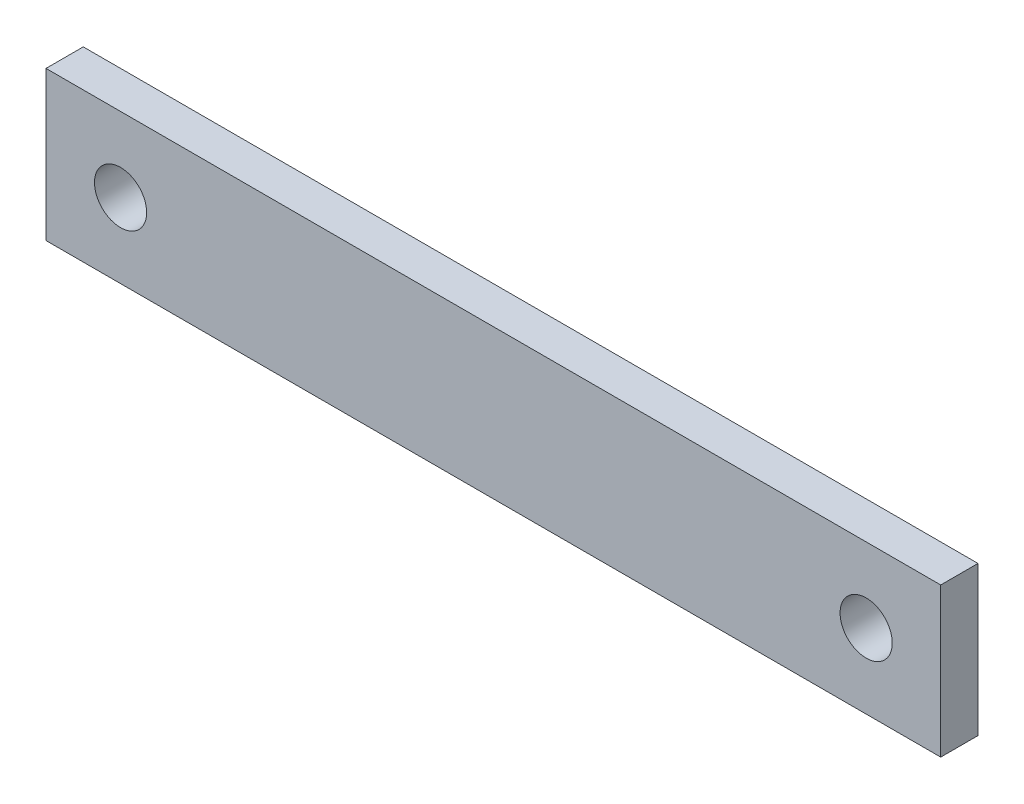
ISO-10303-21;
HEADER;
FILE_DESCRIPTION(('STEP AP214'),'2;1');
FILE_NAME('part.step','',(''),(''),'','','');
FILE_SCHEMA(('AUTOMOTIVE_DESIGN { 1 0 10303 214 1 1 1 1 }'));
ENDSEC;
DATA;
#1=APPLICATION_CONTEXT('core data for automotive mechanical design processes');
#2=APPLICATION_PROTOCOL_DEFINITION('international standard','automotive_design',2000,#1);
#3=PRODUCT_CONTEXT('',#1,'mechanical');
#4=PRODUCT('Part','Part','',(#3));
#5=PRODUCT_RELATED_PRODUCT_CATEGORY('part','',(#4));
#6=PRODUCT_DEFINITION_FORMATION('','',#4);
#7=PRODUCT_DEFINITION_CONTEXT('part definition',#1,'design');
#8=PRODUCT_DEFINITION('design','',#6,#7);
#9=PRODUCT_DEFINITION_SHAPE('','',#8);
#10=(LENGTH_UNIT() NAMED_UNIT(*) SI_UNIT(.MILLI.,.METRE.));
#11=(NAMED_UNIT(*) PLANE_ANGLE_UNIT() SI_UNIT($,.RADIAN.));
#12=(NAMED_UNIT(*) SI_UNIT($,.STERADIAN.) SOLID_ANGLE_UNIT());
#13=UNCERTAINTY_MEASURE_WITH_UNIT(LENGTH_MEASURE(1.E-05),#10,'distance_accuracy_value','');
#14=(GEOMETRIC_REPRESENTATION_CONTEXT(3) GLOBAL_UNCERTAINTY_ASSIGNED_CONTEXT((#13)) GLOBAL_UNIT_ASSIGNED_CONTEXT((#10,
#11,#12)) REPRESENTATION_CONTEXT('',''));
#15=CARTESIAN_POINT('',(0.,0.,0.));
#16=DIRECTION('',(0.,0.,1.));
#17=DIRECTION('',(1.,0.,0.));
#18=AXIS2_PLACEMENT_3D('',#15,#16,#17);
#19=CARTESIAN_POINT('',(0.,0.,10.));
#20=DIRECTION('',(0.,0.,-1.));
#21=DIRECTION('',(-1.,0.,0.));
#22=AXIS2_PLACEMENT_3D('',#19,#20,#21);
#23=PLANE('',#22);
#24=DIRECTION('',(0.,1.,0.));
#25=VECTOR('',#24,1.);
#26=CARTESIAN_POINT('',(120.,-20.,10.));
#27=LINE('',#26,#25);
#28=CARTESIAN_POINT('',(120.,-20.,10.));
#29=VERTEX_POINT('',#28);
#30=CARTESIAN_POINT('',(120.,20.,10.));
#31=VERTEX_POINT('',#30);
#32=EDGE_CURVE('E85',#29,#31,#27,.T.);
#33=ORIENTED_EDGE('',*,*,#32,.T.);
#34=DIRECTION('',(-1.,0.,0.));
#35=VECTOR('',#34,1.);
#36=CARTESIAN_POINT('',(-120.,20.,10.));
#37=LINE('',#36,#35);
#38=CARTESIAN_POINT('',(-120.,20.,10.));
#39=VERTEX_POINT('',#38);
#40=EDGE_CURVE('E80',#31,#39,#37,.T.);
#41=ORIENTED_EDGE('',*,*,#40,.T.);
#42=DIRECTION('',(0.,-1.,0.));
#43=VECTOR('',#42,1.);
#44=CARTESIAN_POINT('',(-120.,-20.,10.));
#45=LINE('',#44,#43);
#46=CARTESIAN_POINT('',(-120.,-20.,10.));
#47=VERTEX_POINT('',#46);
#48=EDGE_CURVE('E83',#39,#47,#45,.T.);
#49=ORIENTED_EDGE('',*,*,#48,.T.);
#50=DIRECTION('',(1.,0.,0.));
#51=VECTOR('',#50,1.);
#52=CARTESIAN_POINT('',(-120.,-20.,10.));
#53=LINE('',#52,#51);
#54=EDGE_CURVE('E50',#47,#29,#53,.T.);
#55=ORIENTED_EDGE('',*,*,#54,.T.);
#56=EDGE_LOOP('',(#33,#41,#49,#55));
#57=FACE_BOUND('',#56,.T.);
#58=CARTESIAN_POINT('',(-100.,0.,10.));
#59=DIRECTION('',(0.,0.,1.));
#60=DIRECTION('',(1.,0.,0.));
#61=AXIS2_PLACEMENT_3D('',#58,#59,#60);
#62=CIRCLE('',#61,7.);
#63=CARTESIAN_POINT('',(-93.,0.,10.));
#64=VERTEX_POINT('',#63);
#65=EDGE_CURVE('E100',#64,#64,#62,.T.);
#66=ORIENTED_EDGE('',*,*,#65,.F.);
#67=EDGE_LOOP('',(#66));
#68=FACE_BOUND('',#67,.T.);
#69=CARTESIAN_POINT('',(100.,0.,10.));
#70=DIRECTION('',(0.,0.,1.));
#71=DIRECTION('',(1.,0.,0.));
#72=AXIS2_PLACEMENT_3D('',#69,#70,#71);
#73=CIRCLE('',#72,7.);
#74=CARTESIAN_POINT('',(107.,0.,10.));
#75=VERTEX_POINT('',#74);
#76=EDGE_CURVE('E115',#75,#75,#73,.T.);
#77=ORIENTED_EDGE('',*,*,#76,.F.);
#78=EDGE_LOOP('',(#77));
#79=FACE_BOUND('',#78,.T.);
#80=ADVANCED_FACE('F33',(#57,#68,#79),#23,.F.);
#81=CARTESIAN_POINT('',(0.,0.,0.));
#82=DIRECTION('',(0.,0.,-1.));
#83=DIRECTION('',(-1.,0.,0.));
#84=AXIS2_PLACEMENT_3D('',#81,#82,#83);
#85=PLANE('',#84);
#86=CARTESIAN_POINT('',(-100.,0.,0.));
#87=DIRECTION('',(0.,0.,1.));
#88=DIRECTION('',(1.,0.,0.));
#89=AXIS2_PLACEMENT_3D('',#86,#87,#88);
#90=CIRCLE('',#89,7.);
#91=CARTESIAN_POINT('',(-93.,0.,0.));
#92=VERTEX_POINT('',#91);
#93=EDGE_CURVE('E112',#92,#92,#90,.T.);
#94=ORIENTED_EDGE('',*,*,#93,.T.);
#95=EDGE_LOOP('',(#94));
#96=FACE_BOUND('',#95,.T.);
#97=DIRECTION('',(0.,1.,0.));
#98=VECTOR('',#97,1.);
#99=CARTESIAN_POINT('',(120.,-20.,0.));
#100=LINE('',#99,#98);
#101=CARTESIAN_POINT('',(120.,-20.,0.));
#102=VERTEX_POINT('',#101);
#103=CARTESIAN_POINT('',(120.,20.,0.));
#104=VERTEX_POINT('',#103);
#105=EDGE_CURVE('E97',#102,#104,#100,.T.);
#106=ORIENTED_EDGE('',*,*,#105,.F.);
#107=DIRECTION('',(1.,0.,0.));
#108=VECTOR('',#107,1.);
#109=CARTESIAN_POINT('',(-120.,-20.,0.));
#110=LINE('',#109,#108);
#111=CARTESIAN_POINT('',(-120.,-20.,0.));
#112=VERTEX_POINT('',#111);
#113=EDGE_CURVE('E73',#112,#102,#110,.T.);
#114=ORIENTED_EDGE('',*,*,#113,.F.);
#115=DIRECTION('',(0.,-1.,0.));
#116=VECTOR('',#115,1.);
#117=CARTESIAN_POINT('',(-120.,-20.,0.));
#118=LINE('',#117,#116);
#119=CARTESIAN_POINT('',(-120.,20.,0.));
#120=VERTEX_POINT('',#119);
#121=EDGE_CURVE('E67',#120,#112,#118,.T.);
#122=ORIENTED_EDGE('',*,*,#121,.F.);
#123=DIRECTION('',(-1.,0.,0.));
#124=VECTOR('',#123,1.);
#125=CARTESIAN_POINT('',(-120.,20.,0.));
#126=LINE('',#125,#124);
#127=EDGE_CURVE('E89',#104,#120,#126,.T.);
#128=ORIENTED_EDGE('',*,*,#127,.F.);
#129=EDGE_LOOP('',(#106,#114,#122,#128));
#130=FACE_BOUND('',#129,.T.);
#131=CARTESIAN_POINT('',(100.,0.,0.));
#132=DIRECTION('',(0.,0.,1.));
#133=DIRECTION('',(1.,0.,0.));
#134=AXIS2_PLACEMENT_3D('',#131,#132,#133);
#135=CIRCLE('',#134,7.);
#136=CARTESIAN_POINT('',(107.,0.,0.));
#137=VERTEX_POINT('',#136);
#138=EDGE_CURVE('E118',#137,#137,#135,.T.);
#139=ORIENTED_EDGE('',*,*,#138,.T.);
#140=EDGE_LOOP('',(#139));
#141=FACE_BOUND('',#140,.T.);
#142=ADVANCED_FACE('F108',(#96,#130,#141),#85,.T.);
#143=CARTESIAN_POINT('',(120.,-20.,10.));
#144=DIRECTION('',(-1.,0.,0.));
#145=DIRECTION('',(0.,0.,1.));
#146=AXIS2_PLACEMENT_3D('',#143,#144,#145);
#147=PLANE('',#146);
#148=ORIENTED_EDGE('',*,*,#105,.T.);
#149=DIRECTION('',(0.,0.,-1.));
#150=VECTOR('',#149,1.);
#151=CARTESIAN_POINT('',(120.,20.,10.));
#152=LINE('',#151,#150);
#153=EDGE_CURVE('E11',#31,#104,#152,.T.);
#154=ORIENTED_EDGE('',*,*,#153,.F.);
#155=ORIENTED_EDGE('',*,*,#32,.F.);
#156=DIRECTION('',(0.,0.,-1.));
#157=VECTOR('',#156,1.);
#158=CARTESIAN_POINT('',(120.,-20.,10.));
#159=LINE('',#158,#157);
#160=EDGE_CURVE('E93',#29,#102,#159,.T.);
#161=ORIENTED_EDGE('',*,*,#160,.T.);
#162=EDGE_LOOP('',(#148,#154,#155,#161));
#163=FACE_BOUND('',#162,.T.);
#164=ADVANCED_FACE('F35',(#163),#147,.F.);
#165=CARTESIAN_POINT('',(-120.,20.,10.));
#166=DIRECTION('',(0.,-1.,0.));
#167=DIRECTION('',(0.,0.,-1.));
#168=AXIS2_PLACEMENT_3D('',#165,#166,#167);
#169=PLANE('',#168);
#170=ORIENTED_EDGE('',*,*,#127,.T.);
#171=DIRECTION('',(0.,0.,-1.));
#172=VECTOR('',#171,1.);
#173=CARTESIAN_POINT('',(-120.,20.,10.));
#174=LINE('',#173,#172);
#175=EDGE_CURVE('E42',#39,#120,#174,.T.);
#176=ORIENTED_EDGE('',*,*,#175,.F.);
#177=ORIENTED_EDGE('',*,*,#40,.F.);
#178=ORIENTED_EDGE('',*,*,#153,.T.);
#179=EDGE_LOOP('',(#170,#176,#177,#178));
#180=FACE_BOUND('',#179,.T.);
#181=ADVANCED_FACE('F88',(#180),#169,.F.);
#182=CARTESIAN_POINT('',(-120.,-20.,10.));
#183=DIRECTION('',(1.,0.,0.));
#184=DIRECTION('',(0.,0.,-1.));
#185=AXIS2_PLACEMENT_3D('',#182,#183,#184);
#186=PLANE('',#185);
#187=ORIENTED_EDGE('',*,*,#121,.T.);
#188=DIRECTION('',(0.,0.,-1.));
#189=VECTOR('',#188,1.);
#190=CARTESIAN_POINT('',(-120.,-20.,10.));
#191=LINE('',#190,#189);
#192=EDGE_CURVE('E90',#47,#112,#191,.T.);
#193=ORIENTED_EDGE('',*,*,#192,.F.);
#194=ORIENTED_EDGE('',*,*,#48,.F.);
#195=ORIENTED_EDGE('',*,*,#175,.T.);
#196=EDGE_LOOP('',(#187,#193,#194,#195));
#197=FACE_BOUND('',#196,.T.);
#198=ADVANCED_FACE('F91',(#197),#186,.F.);
#199=CARTESIAN_POINT('',(-120.,-20.,10.));
#200=DIRECTION('',(0.,1.,0.));
#201=DIRECTION('',(0.,0.,1.));
#202=AXIS2_PLACEMENT_3D('',#199,#200,#201);
#203=PLANE('',#202);
#204=ORIENTED_EDGE('',*,*,#113,.T.);
#205=ORIENTED_EDGE('',*,*,#160,.F.);
#206=ORIENTED_EDGE('',*,*,#54,.F.);
#207=ORIENTED_EDGE('',*,*,#192,.T.);
#208=EDGE_LOOP('',(#204,#205,#206,#207));
#209=FACE_BOUND('',#208,.T.);
#210=ADVANCED_FACE('F105',(#209),#203,.F.);
#211=CARTESIAN_POINT('',(-100.,0.,10.));
#212=DIRECTION('',(0.,0.,-1.));
#213=DIRECTION('',(-1.,0.,0.));
#214=AXIS2_PLACEMENT_3D('',#211,#212,#213);
#215=CYLINDRICAL_SURFACE('',#214,7.);
#216=ORIENTED_EDGE('',*,*,#65,.T.);
#217=EDGE_LOOP('',(#216));
#218=FACE_BOUND('',#217,.T.);
#219=ORIENTED_EDGE('',*,*,#93,.F.);
#220=EDGE_LOOP('',(#219));
#221=FACE_BOUND('',#220,.T.);
#222=ADVANCED_FACE('F135',(#218,#221),#215,.F.);
#223=CARTESIAN_POINT('',(100.,0.,10.));
#224=DIRECTION('',(0.,0.,-1.));
#225=DIRECTION('',(-1.,0.,0.));
#226=AXIS2_PLACEMENT_3D('',#223,#224,#225);
#227=CYLINDRICAL_SURFACE('',#226,7.);
#228=ORIENTED_EDGE('',*,*,#76,.T.);
#229=EDGE_LOOP('',(#228));
#230=FACE_BOUND('',#229,.T.);
#231=ORIENTED_EDGE('',*,*,#138,.F.);
#232=EDGE_LOOP('',(#231));
#233=FACE_BOUND('',#232,.T.);
#234=ADVANCED_FACE('F124',(#230,#233),#227,.F.);
#235=CLOSED_SHELL('',(#80,#142,#164,#181,#198,#210,#222,#234));
#236=MANIFOLD_SOLID_BREP('B2',#235);
#237=ADVANCED_BREP_SHAPE_REPRESENTATION('',(#18,#236),#14);
#238=SHAPE_DEFINITION_REPRESENTATION(#9,#237);
ENDSEC;
END-ISO-10303-21;
